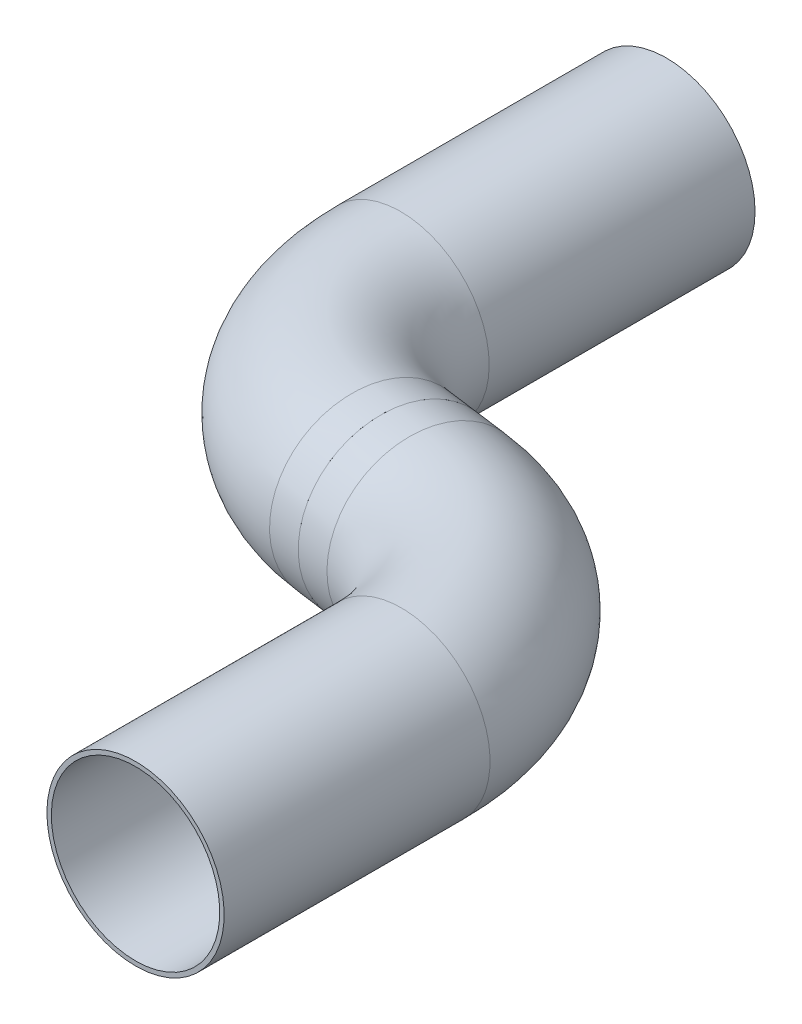
ISO-10303-21;
HEADER;
FILE_DESCRIPTION(('STEP AP214'),'2;1');
FILE_NAME('part.step','',(''),(''),'','','');
FILE_SCHEMA(('AUTOMOTIVE_DESIGN { 1 0 10303 214 1 1 1 1 }'));
ENDSEC;
DATA;
#1=APPLICATION_CONTEXT('core data for automotive mechanical design processes');
#2=APPLICATION_PROTOCOL_DEFINITION('international standard','automotive_design',2000,#1);
#3=PRODUCT_CONTEXT('',#1,'mechanical');
#4=PRODUCT('Part','Part','',(#3));
#5=PRODUCT_RELATED_PRODUCT_CATEGORY('part','',(#4));
#6=PRODUCT_DEFINITION_FORMATION('','',#4);
#7=PRODUCT_DEFINITION_CONTEXT('part definition',#1,'design');
#8=PRODUCT_DEFINITION('design','',#6,#7);
#9=PRODUCT_DEFINITION_SHAPE('','',#8);
#10=(LENGTH_UNIT() NAMED_UNIT(*) SI_UNIT(.MILLI.,.METRE.));
#11=(NAMED_UNIT(*) PLANE_ANGLE_UNIT() SI_UNIT($,.RADIAN.));
#12=(NAMED_UNIT(*) SI_UNIT($,.STERADIAN.) SOLID_ANGLE_UNIT());
#13=UNCERTAINTY_MEASURE_WITH_UNIT(LENGTH_MEASURE(1.E-05),#10,'distance_accuracy_value','');
#14=(GEOMETRIC_REPRESENTATION_CONTEXT(3) GLOBAL_UNCERTAINTY_ASSIGNED_CONTEXT((#13)) GLOBAL_UNIT_ASSIGNED_CONTEXT((#10,
#11,#12)) REPRESENTATION_CONTEXT('',''));
#15=CARTESIAN_POINT('',(0.,0.,0.));
#16=DIRECTION('',(0.,0.,1.));
#17=DIRECTION('',(1.,0.,0.));
#18=AXIS2_PLACEMENT_3D('',#15,#16,#17);
#19=CARTESIAN_POINT('',(-4.44022307602449,16.6732254550402,14.163709272431));
#20=DIRECTION('',(0.,0.,1.));
#21=DIRECTION('',(1.,0.,0.));
#22=AXIS2_PLACEMENT_3D('',#19,#20,#21);
#23=PLANE('',#22);
#24=CARTESIAN_POINT('',(-4.44022307602449,16.6732254550402,14.163709272431));
#25=DIRECTION('',(0.,0.,1.));
#26=DIRECTION('',(1.,0.,0.));
#27=AXIS2_PLACEMENT_3D('',#24,#25,#26);
#28=CIRCLE('',#27,5.);
#29=CARTESIAN_POINT('',(0.559776923975509,16.6732254550402,14.163709272431));
#30=VERTEX_POINT('',#29);
#31=EDGE_CURVE('P0_E18',#30,#30,#28,.T.);
#32=ORIENTED_EDGE('',*,*,#31,.F.);
#33=EDGE_LOOP('',(#32));
#34=FACE_BOUND('',#33,.T.);
#35=CARTESIAN_POINT('',(-4.44022307602449,16.6732254550402,14.163709272431));
#36=DIRECTION('',(0.,0.,1.));
#37=DIRECTION('',(1.,0.,0.));
#38=AXIS2_PLACEMENT_3D('',#35,#36,#37);
#39=CIRCLE('',#38,4.75);
#40=CARTESIAN_POINT('',(0.309776923975509,16.6732254550402,14.163709272431));
#41=VERTEX_POINT('',#40);
#42=EDGE_CURVE('P0_E25',#41,#41,#39,.T.);
#43=ORIENTED_EDGE('',*,*,#42,.T.);
#44=EDGE_LOOP('',(#43));
#45=FACE_BOUND('',#44,.T.);
#46=ADVANCED_FACE('P0_F14',(#34,#45),#23,.F.);
#47=CARTESIAN_POINT('',(-4.44022307602449,16.6732254550402,29.163709272431));
#48=DIRECTION('',(0.,0.,-1.));
#49=DIRECTION('',(-1.,0.,0.));
#50=AXIS2_PLACEMENT_3D('',#47,#48,#49);
#51=CYLINDRICAL_SURFACE('',#50,5.);
#52=CARTESIAN_POINT('',(-4.44022307602449,16.6732254550402,29.163709272431));
#53=DIRECTION('',(0.,0.,1.));
#54=DIRECTION('',(1.,0.,0.));
#55=AXIS2_PLACEMENT_3D('',#52,#53,#54);
#56=CIRCLE('',#55,5.);
#57=CARTESIAN_POINT('',(-9.43368691463852,16.4176498449871,29.163709272431));
#58=VERTEX_POINT('',#57);
#59=EDGE_CURVE('P0_E10',#58,#58,#56,.T.);
#60=ORIENTED_EDGE('',*,*,#59,.F.);
#61=EDGE_LOOP('',(#60));
#62=FACE_BOUND('',#61,.T.);
#63=ORIENTED_EDGE('',*,*,#31,.T.);
#64=EDGE_LOOP('',(#63));
#65=FACE_BOUND('',#64,.T.);
#66=ADVANCED_FACE('P0_F16',(#62,#65),#51,.T.);
#67=CARTESIAN_POINT('',(-4.44022307602449,16.6732254550402,29.163709272431));
#68=DIRECTION('',(0.,0.,-1.));
#69=DIRECTION('',(-1.,0.,0.));
#70=AXIS2_PLACEMENT_3D('',#67,#68,#69);
#71=CYLINDRICAL_SURFACE('',#70,4.75);
#72=CARTESIAN_POINT('',(-4.44022307602449,16.6732254550402,29.163709272431));
#73=DIRECTION('',(0.,0.,1.));
#74=DIRECTION('',(1.,0.,0.));
#75=AXIS2_PLACEMENT_3D('',#72,#73,#74);
#76=CIRCLE('',#75,4.75);
#77=CARTESIAN_POINT('',(-9.18401372270782,16.4304286254897,29.163709272431));
#78=VERTEX_POINT('',#77);
#79=EDGE_CURVE('P0_E32',#78,#78,#76,.T.);
#80=ORIENTED_EDGE('',*,*,#79,.T.);
#81=EDGE_LOOP('',(#80));
#82=FACE_BOUND('',#81,.T.);
#83=ORIENTED_EDGE('',*,*,#42,.F.);
#84=EDGE_LOOP('',(#83));
#85=FACE_BOUND('',#84,.T.);
#86=ADVANCED_FACE('P0_F70',(#82,#85),#71,.F.);
#87=CARTESIAN_POINT('',(5.54670460120357,17.1843766751465,29.163709272431));
#88=DIRECTION('',(0.051115122010631,-0.998692767722806,0.));
#89=DIRECTION('',(0.998692767722806,0.051115122010631,0.));
#90=AXIS2_PLACEMENT_3D('',#87,#88,#89);
#91=TOROIDAL_SURFACE('',#90,10.,4.75);
#92=CARTESIAN_POINT('',(3.81249280956152,17.0956161972629,39.0117868025531));
#93=DIRECTION('',(0.98352038053064,0.0503385684522344,0.173648177666927));
#94=DIRECTION('',(0.173868606440012,0.,-0.984768860034987));
#95=AXIS2_PLACEMENT_3D('',#92,#93,#94);
#96=CIRCLE('',#95,4.75);
#97=CARTESIAN_POINT('',(2.98874220853154,17.0534549702681,43.6896236293611));
#98=VERTEX_POINT('',#97);
#99=EDGE_CURVE('P0_E39',#98,#98,#96,.T.);
#100=CARTESIAN_POINT('',(5.54670460120357,17.1843766751465,29.163709272431));
#101=DIRECTION('',(0.051115122010631,-0.998692767722806,0.));
#102=DIRECTION('',(0.998692767722806,0.051115122010631,0.));
#103=AXIS2_PLACEMENT_3D('',#100,#101,#102);
#104=CIRCLE('',#103,14.75);
#105=EDGE_CURVE('',#98,#78,#104,.T.);
#106=ORIENTED_EDGE('',*,*,#99,.T.);
#107=ORIENTED_EDGE('',*,*,#79,.F.);
#108=ORIENTED_EDGE('',*,*,#105,.T.);
#109=ORIENTED_EDGE('',*,*,#105,.F.);
#110=EDGE_LOOP('',(#106,#108,#107,#109));
#111=FACE_BOUND('',#110,.T.);
#112=ADVANCED_FACE('P0_F61',(#111),#91,.F.);
#113=CARTESIAN_POINT('',(5.54670460120357,17.1843766751465,29.163709272431));
#114=DIRECTION('',(0.051115122010631,-0.998692767722806,0.));
#115=DIRECTION('',(0.998692767722806,0.051115122010631,0.));
#116=AXIS2_PLACEMENT_3D('',#113,#114,#115);
#117=TOROIDAL_SURFACE('',#116,10.,5.);
#118=CARTESIAN_POINT('',(3.81249280956151,17.0956161972629,39.0117868025531));
#119=DIRECTION('',(0.98352038053064,0.0503385684522344,0.173648177666927));
#120=DIRECTION('',(0.175807233099414,-0.0421838579410801,-0.98352038053064));
#121=AXIS2_PLACEMENT_3D('',#118,#119,#120);
#122=CIRCLE('',#121,5.);
#123=CARTESIAN_POINT('',(2.94538691374049,17.051235958321,43.9358255676141));
#124=VERTEX_POINT('',#123);
#125=EDGE_CURVE('P0_E29',#124,#124,#122,.T.);
#126=CARTESIAN_POINT('',(5.54670460120357,17.1843766751465,29.163709272431));
#127=DIRECTION('',(0.051115122010631,-0.998692767722806,0.));
#128=DIRECTION('',(0.998692767722806,0.051115122010631,0.));
#129=AXIS2_PLACEMENT_3D('',#126,#127,#128);
#130=CIRCLE('',#129,15.);
#131=EDGE_CURVE('',#124,#58,#130,.T.);
#132=ORIENTED_EDGE('',*,*,#125,.F.);
#133=ORIENTED_EDGE('',*,*,#59,.T.);
#134=ORIENTED_EDGE('',*,*,#131,.T.);
#135=ORIENTED_EDGE('',*,*,#131,.F.);
#136=EDGE_LOOP('',(#132,#134,#133,#135));
#137=FACE_BOUND('',#136,.T.);
#138=ADVANCED_FACE('P0_F51',(#137),#117,.T.);
#139=CARTESIAN_POINT('',(5.7795335706228,17.1962933341673,39.3590831578869));
#140=DIRECTION('',(0.98352038053064,0.0503385684522344,0.173648177666927));
#141=DIRECTION('',(0.173868606440012,0.,-0.984768860034987));
#142=AXIS2_PLACEMENT_3D('',#139,#140,#141);
#143=PLANE('',#142);
#144=CARTESIAN_POINT('',(5.7795335706228,17.1962933341673,39.3590831578869));
#145=DIRECTION('',(0.98352038053064,0.0503385684522344,0.173648177666927));
#146=DIRECTION('',(0.173868606440012,0.,-0.984768860034987));
#147=AXIS2_PLACEMENT_3D('',#144,#145,#146);
#148=CIRCLE('',#147,5.);
#149=CARTESIAN_POINT('',(6.64887660282286,17.1962933341673,34.435238857712));
#150=VERTEX_POINT('',#149);
#151=EDGE_CURVE('P0_E35',#150,#150,#148,.T.);
#152=ORIENTED_EDGE('',*,*,#151,.T.);
#153=EDGE_LOOP('',(#152));
#154=FACE_BOUND('',#153,.T.);
#155=CARTESIAN_POINT('',(5.7795335706228,17.1962933341673,39.3590831578869));
#156=DIRECTION('',(0.98352038053064,0.0503385684522344,0.173648177666927));
#157=DIRECTION('',(0.173868606440012,0.,-0.984768860034987));
#158=AXIS2_PLACEMENT_3D('',#155,#156,#157);
#159=CIRCLE('',#158,4.75);
#160=CARTESIAN_POINT('',(6.60540945121285,17.1962933341673,34.6814310727207));
#161=VERTEX_POINT('',#160);
#162=EDGE_CURVE('P0_E38',#161,#161,#159,.T.);
#163=ORIENTED_EDGE('',*,*,#162,.F.);
#164=EDGE_LOOP('',(#163));
#165=FACE_BOUND('',#164,.T.);
#166=ADVANCED_FACE('P0_F48',(#154,#165),#143,.T.);
#167=CARTESIAN_POINT('',(5.7795335706228,17.1962933341673,39.3590831578869));
#168=DIRECTION('',(-0.98352038053064,-0.0503385684522344,-0.173648177666927));
#169=DIRECTION('',(-0.173868606440012,0.,0.984768860034987));
#170=AXIS2_PLACEMENT_3D('',#167,#168,#169);
#171=CYLINDRICAL_SURFACE('',#170,5.);
#172=ORIENTED_EDGE('',*,*,#151,.F.);
#173=EDGE_LOOP('',(#172));
#174=FACE_BOUND('',#173,.T.);
#175=ORIENTED_EDGE('',*,*,#125,.T.);
#176=EDGE_LOOP('',(#175));
#177=FACE_BOUND('',#176,.T.);
#178=ADVANCED_FACE('P0_F50',(#174,#177),#171,.T.);
#179=CARTESIAN_POINT('',(5.7795335706228,17.1962933341673,39.3590831578869));
#180=DIRECTION('',(-0.98352038053064,-0.0503385684522344,-0.173648177666927));
#181=DIRECTION('',(-0.173868606440012,0.,0.984768860034987));
#182=AXIS2_PLACEMENT_3D('',#179,#180,#181);
#183=CYLINDRICAL_SURFACE('',#182,4.75);
#184=ORIENTED_EDGE('',*,*,#162,.T.);
#185=EDGE_LOOP('',(#184));
#186=FACE_BOUND('',#185,.T.);
#187=ORIENTED_EDGE('',*,*,#99,.F.);
#188=EDGE_LOOP('',(#187));
#189=FACE_BOUND('',#188,.T.);
#190=ADVANCED_FACE('P0_F45',(#186,#189),#183,.F.);
#191=CLOSED_SHELL('',(#46,#66,#86,#112,#138,#166,#178,#190));
#192=MANIFOLD_SOLID_BREP('P0_B1',#191);
#193=CARTESIAN_POINT('',(15.9992902172701,17.7193612132944,64.5544570433429));
#194=DIRECTION('',(0.,0.,-1.));
#195=DIRECTION('',(-0.994774488603677,-0.102096605346572,0.));
#196=AXIS2_PLACEMENT_3D('',#193,#194,#195);
#197=PLANE('',#196);
#198=CARTESIAN_POINT('',(15.9992902172701,17.7193612132944,64.5544570433429));
#199=DIRECTION('',(0.,0.,-1.));
#200=DIRECTION('',(-0.994774488603677,-0.102096605346572,0.));
#201=AXIS2_PLACEMENT_3D('',#198,#199,#200);
#202=CIRCLE('',#201,5.);
#203=CARTESIAN_POINT('',(11.0254177742517,17.2088781865616,64.5544570433429));
#204=VERTEX_POINT('',#203);
#205=EDGE_CURVE('P1_E18',#204,#204,#202,.T.);
#206=ORIENTED_EDGE('',*,*,#205,.F.);
#207=EDGE_LOOP('',(#206));
#208=FACE_BOUND('',#207,.T.);
#209=CARTESIAN_POINT('',(15.9992902172701,17.7193612132944,64.5544570433429));
#210=DIRECTION('',(0.,0.,-1.));
#211=DIRECTION('',(-0.994774488603677,-0.102096605346572,0.));
#212=AXIS2_PLACEMENT_3D('',#209,#210,#211);
#213=CIRCLE('',#212,4.75);
#214=CARTESIAN_POINT('',(11.2741113964026,17.2344023378982,64.5544570433429));
#215=VERTEX_POINT('',#214);
#216=EDGE_CURVE('P1_E25',#215,#215,#213,.T.);
#217=ORIENTED_EDGE('',*,*,#216,.T.);
#218=EDGE_LOOP('',(#217));
#219=FACE_BOUND('',#218,.T.);
#220=ADVANCED_FACE('P1_F14',(#208,#219),#197,.F.);
#221=CARTESIAN_POINT('',(15.9992902172701,17.7193612132944,49.5544570433429));
#222=DIRECTION('',(0.,0.,1.));
#223=DIRECTION('',(0.994774488603677,0.102096605346572,0.));
#224=AXIS2_PLACEMENT_3D('',#221,#222,#223);
#225=CYLINDRICAL_SURFACE('',#224,5.);
#226=CARTESIAN_POINT('',(15.9992902172701,17.7193612132944,49.5544570433429));
#227=DIRECTION('',(0.,0.,-1.));
#228=DIRECTION('',(-0.994774488603677,-0.102096605346572,0.));
#229=AXIS2_PLACEMENT_3D('',#226,#227,#228);
#230=CIRCLE('',#229,5.);
#231=CARTESIAN_POINT('',(20.9927540558841,17.9749368233476,49.5544570433429));
#232=VERTEX_POINT('',#231);
#233=EDGE_CURVE('P1_E10',#232,#232,#230,.T.);
#234=ORIENTED_EDGE('',*,*,#233,.F.);
#235=EDGE_LOOP('',(#234));
#236=FACE_BOUND('',#235,.T.);
#237=ORIENTED_EDGE('',*,*,#205,.T.);
#238=EDGE_LOOP('',(#237));
#239=FACE_BOUND('',#238,.T.);
#240=ADVANCED_FACE('P1_F16',(#236,#239),#225,.T.);
#241=CARTESIAN_POINT('',(15.9992902172701,17.7193612132944,49.5544570433429));
#242=DIRECTION('',(0.,0.,1.));
#243=DIRECTION('',(0.994774488603677,0.102096605346572,0.));
#244=AXIS2_PLACEMENT_3D('',#241,#242,#243);
#245=CYLINDRICAL_SURFACE('',#244,4.75);
#246=CARTESIAN_POINT('',(15.9992902172701,17.7193612132944,49.5544570433429));
#247=DIRECTION('',(0.,0.,-1.));
#248=DIRECTION('',(-0.994774488603677,-0.102096605346572,0.));
#249=AXIS2_PLACEMENT_3D('',#246,#247,#248);
#250=CIRCLE('',#249,4.75);
#251=CARTESIAN_POINT('',(20.7430808639534,17.9621580428449,49.5544570433429));
#252=VERTEX_POINT('',#251);
#253=EDGE_CURVE('P1_E32',#252,#252,#250,.T.);
#254=ORIENTED_EDGE('',*,*,#253,.T.);
#255=EDGE_LOOP('',(#254));
#256=FACE_BOUND('',#255,.T.);
#257=ORIENTED_EDGE('',*,*,#216,.F.);
#258=EDGE_LOOP('',(#257));
#259=FACE_BOUND('',#258,.T.);
#260=ADVANCED_FACE('P1_F70',(#256,#259),#245,.F.);
#261=CARTESIAN_POINT('',(6.01236254004202,17.2082099931881,49.5544570433429));
#262=DIRECTION('',(0.051115122010631,-0.998692767722806,0.));
#263=DIRECTION('',(-0.998692767722806,-0.0511151220106309,0.));
#264=AXIS2_PLACEMENT_3D('',#261,#262,#263);
#265=TOROIDAL_SURFACE('',#264,10.,4.75);
#266=CARTESIAN_POINT('',(7.74657433168407,17.2969704710718,39.7063795132208));
#267=DIRECTION('',(-0.98352038053064,-0.0503385684522343,-0.173648177666927));
#268=DIRECTION('',(-0.172960054055597,-0.0177513944938644,0.984768860034987));
#269=AXIS2_PLACEMENT_3D('',#266,#267,#268);
#270=CIRCLE('',#269,4.75);
#271=CARTESIAN_POINT('',(8.57032493271405,17.3391316980666,35.0285426864128));
#272=VERTEX_POINT('',#271);
#273=EDGE_CURVE('P1_E39',#272,#272,#270,.T.);
#274=CARTESIAN_POINT('',(6.01236254004202,17.2082099931881,49.5544570433429));
#275=DIRECTION('',(0.051115122010631,-0.998692767722806,0.));
#276=DIRECTION('',(-0.998692767722806,-0.0511151220106309,0.));
#277=AXIS2_PLACEMENT_3D('',#274,#275,#276);
#278=CIRCLE('',#277,14.75);
#279=EDGE_CURVE('',#272,#252,#278,.T.);
#280=ORIENTED_EDGE('',*,*,#273,.T.);
#281=ORIENTED_EDGE('',*,*,#253,.F.);
#282=ORIENTED_EDGE('',*,*,#279,.T.);
#283=ORIENTED_EDGE('',*,*,#279,.F.);
#284=EDGE_LOOP('',(#280,#282,#281,#283));
#285=FACE_BOUND('',#284,.T.);
#286=ADVANCED_FACE('P1_F61',(#285),#265,.F.);
#287=CARTESIAN_POINT('',(6.01236254004202,17.2082099931881,49.5544570433429));
#288=DIRECTION('',(0.051115122010631,-0.998692767722806,0.));
#289=DIRECTION('',(-0.998692767722806,-0.0511151220106309,0.));
#290=AXIS2_PLACEMENT_3D('',#287,#288,#289);
#291=TOROIDAL_SURFACE('',#290,10.,5.);
#292=CARTESIAN_POINT('',(7.74657433168408,17.2969704710718,39.7063795132208));
#293=DIRECTION('',(-0.98352038053064,-0.0503385684522343,-0.173648177666927));
#294=DIRECTION('',(-0.170581721703091,-0.0599127474054918,0.98352038053064));
#295=AXIS2_PLACEMENT_3D('',#292,#293,#294);
#296=CIRCLE('',#295,5.);
#297=CARTESIAN_POINT('',(8.61368022750511,17.3413507100136,34.7823407481598));
#298=VERTEX_POINT('',#297);
#299=EDGE_CURVE('P1_E29',#298,#298,#296,.T.);
#300=CARTESIAN_POINT('',(6.01236254004202,17.2082099931881,49.5544570433429));
#301=DIRECTION('',(0.051115122010631,-0.998692767722806,0.));
#302=DIRECTION('',(-0.998692767722806,-0.0511151220106309,0.));
#303=AXIS2_PLACEMENT_3D('',#300,#301,#302);
#304=CIRCLE('',#303,15.);
#305=EDGE_CURVE('',#298,#232,#304,.T.);
#306=ORIENTED_EDGE('',*,*,#299,.F.);
#307=ORIENTED_EDGE('',*,*,#233,.T.);
#308=ORIENTED_EDGE('',*,*,#305,.T.);
#309=ORIENTED_EDGE('',*,*,#305,.F.);
#310=EDGE_LOOP('',(#306,#308,#307,#309));
#311=FACE_BOUND('',#310,.T.);
#312=ADVANCED_FACE('P1_F51',(#311),#291,.T.);
#313=CARTESIAN_POINT('',(5.7795335706228,17.1962933341673,39.3590831578869));
#314=DIRECTION('',(-0.98352038053064,-0.0503385684522343,-0.173648177666927));
#315=DIRECTION('',(-0.172960054055597,-0.0177513944938644,0.984768860034987));
#316=AXIS2_PLACEMENT_3D('',#313,#314,#315);
#317=PLANE('',#316);
#318=CARTESIAN_POINT('',(5.7795335706228,17.1962933341673,39.3590831578869));
#319=DIRECTION('',(-0.98352038053064,-0.0503385684522343,-0.173648177666927));
#320=DIRECTION('',(-0.172960054055597,-0.0177513944938644,0.984768860034987));
#321=AXIS2_PLACEMENT_3D('',#318,#319,#320);
#322=CIRCLE('',#321,5.);
#323=CARTESIAN_POINT('',(4.91473330034481,17.107536361698,44.2829274580619));
#324=VERTEX_POINT('',#323);
#325=EDGE_CURVE('P1_E35',#324,#324,#322,.T.);
#326=ORIENTED_EDGE('',*,*,#325,.T.);
#327=EDGE_LOOP('',(#326));
#328=FACE_BOUND('',#327,.T.);
#329=CARTESIAN_POINT('',(5.7795335706228,17.1962933341673,39.3590831578869));
#330=DIRECTION('',(-0.98352038053064,-0.0503385684522343,-0.173648177666927));
#331=DIRECTION('',(-0.172960054055597,-0.0177513944938644,0.984768860034987));
#332=AXIS2_PLACEMENT_3D('',#329,#330,#331);
#333=CIRCLE('',#332,4.75);
#334=CARTESIAN_POINT('',(4.95797331385871,17.1119742103215,44.0367352430531));
#335=VERTEX_POINT('',#334);
#336=EDGE_CURVE('P1_E38',#335,#335,#333,.T.);
#337=ORIENTED_EDGE('',*,*,#336,.F.);
#338=EDGE_LOOP('',(#337));
#339=FACE_BOUND('',#338,.T.);
#340=ADVANCED_FACE('P1_F48',(#328,#339),#317,.T.);
#341=CARTESIAN_POINT('',(5.7795335706228,17.1962933341673,39.3590831578869));
#342=DIRECTION('',(0.98352038053064,0.0503385684522343,0.173648177666927));
#343=DIRECTION('',(0.172960054055597,0.0177513944938644,-0.984768860034987));
#344=AXIS2_PLACEMENT_3D('',#341,#342,#343);
#345=CYLINDRICAL_SURFACE('',#344,5.);
#346=ORIENTED_EDGE('',*,*,#325,.F.);
#347=EDGE_LOOP('',(#346));
#348=FACE_BOUND('',#347,.T.);
#349=ORIENTED_EDGE('',*,*,#299,.T.);
#350=EDGE_LOOP('',(#349));
#351=FACE_BOUND('',#350,.T.);
#352=ADVANCED_FACE('P1_F50',(#348,#351),#345,.T.);
#353=CARTESIAN_POINT('',(5.7795335706228,17.1962933341673,39.3590831578869));
#354=DIRECTION('',(0.98352038053064,0.0503385684522343,0.173648177666927));
#355=DIRECTION('',(0.172960054055597,0.0177513944938644,-0.984768860034987));
#356=AXIS2_PLACEMENT_3D('',#353,#354,#355);
#357=CYLINDRICAL_SURFACE('',#356,4.75);
#358=ORIENTED_EDGE('',*,*,#336,.T.);
#359=EDGE_LOOP('',(#358));
#360=FACE_BOUND('',#359,.T.);
#361=ORIENTED_EDGE('',*,*,#273,.F.);
#362=EDGE_LOOP('',(#361));
#363=FACE_BOUND('',#362,.T.);
#364=ADVANCED_FACE('P1_F45',(#360,#363),#357,.F.);
#365=CLOSED_SHELL('',(#220,#240,#260,#286,#312,#340,#352,#364));
#366=MANIFOLD_SOLID_BREP('P1_B1',#365);
#367=ADVANCED_BREP_SHAPE_REPRESENTATION('',(#18,#192,#366),#14);
#368=SHAPE_DEFINITION_REPRESENTATION(#9,#367);
ENDSEC;
END-ISO-10303-21;
